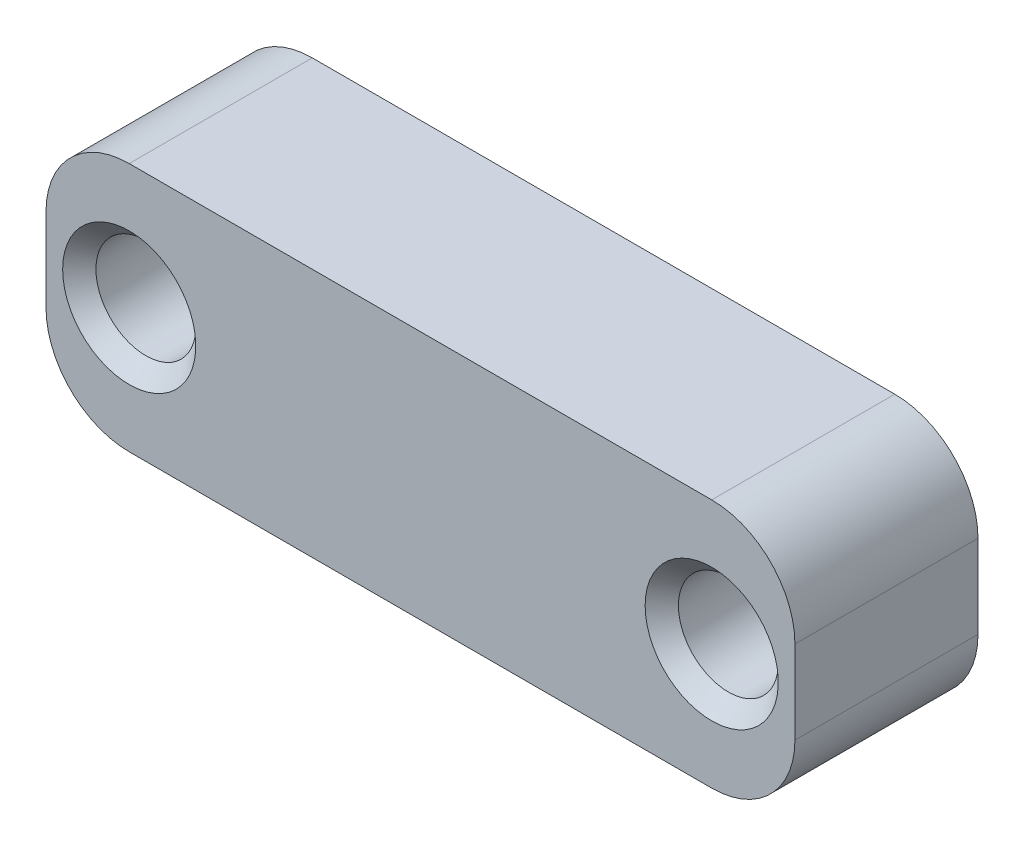
ISO-10303-21;
HEADER;
FILE_DESCRIPTION(('STEP AP214'),'2;1');
FILE_NAME('part.step','',(''),(''),'','','');
FILE_SCHEMA(('AUTOMOTIVE_DESIGN { 1 0 10303 214 1 1 1 1 }'));
ENDSEC;
DATA;
#1=APPLICATION_CONTEXT('core data for automotive mechanical design processes');
#2=APPLICATION_PROTOCOL_DEFINITION('international standard','automotive_design',2000,#1);
#3=PRODUCT_CONTEXT('',#1,'mechanical');
#4=PRODUCT('Part','Part','',(#3));
#5=PRODUCT_RELATED_PRODUCT_CATEGORY('part','',(#4));
#6=PRODUCT_DEFINITION_FORMATION('','',#4);
#7=PRODUCT_DEFINITION_CONTEXT('part definition',#1,'design');
#8=PRODUCT_DEFINITION('design','',#6,#7);
#9=PRODUCT_DEFINITION_SHAPE('','',#8);
#10=(LENGTH_UNIT() NAMED_UNIT(*) SI_UNIT(.MILLI.,.METRE.));
#11=(NAMED_UNIT(*) PLANE_ANGLE_UNIT() SI_UNIT($,.RADIAN.));
#12=(NAMED_UNIT(*) SI_UNIT($,.STERADIAN.) SOLID_ANGLE_UNIT());
#13=UNCERTAINTY_MEASURE_WITH_UNIT(LENGTH_MEASURE(1.E-05),#10,'distance_accuracy_value','');
#14=(GEOMETRIC_REPRESENTATION_CONTEXT(3) GLOBAL_UNCERTAINTY_ASSIGNED_CONTEXT((#13)) GLOBAL_UNIT_ASSIGNED_CONTEXT((#10,
#11,#12)) REPRESENTATION_CONTEXT('',''));
#15=CARTESIAN_POINT('',(0.,0.,0.));
#16=DIRECTION('',(0.,0.,1.));
#17=DIRECTION('',(1.,0.,0.));
#18=AXIS2_PLACEMENT_3D('',#15,#16,#17);
#19=CARTESIAN_POINT('',(0.,0.,11.));
#20=DIRECTION('',(0.,0.,-1.));
#21=DIRECTION('',(-1.,0.,0.));
#22=AXIS2_PLACEMENT_3D('',#19,#20,#21);
#23=PLANE('',#22);
#24=CARTESIAN_POINT('',(40.,7.5,11.));
#25=DIRECTION('',(0.,0.,-1.));
#26=DIRECTION('',(-1.,0.,0.));
#27=AXIS2_PLACEMENT_3D('',#24,#25,#26);
#28=CIRCLE('',#27,4.00000000000001);
#29=CARTESIAN_POINT('',(36.,7.5,11.));
#30=VERTEX_POINT('',#29);
#31=EDGE_CURVE('E41',#30,#30,#28,.T.);
#32=ORIENTED_EDGE('',*,*,#31,.T.);
#33=EDGE_LOOP('',(#32));
#34=FACE_BOUND('',#33,.T.);
#35=CARTESIAN_POINT('',(5.,7.5,11.));
#36=DIRECTION('',(0.,0.,-1.));
#37=DIRECTION('',(-1.,0.,0.));
#38=AXIS2_PLACEMENT_3D('',#35,#36,#37);
#39=CIRCLE('',#38,4.);
#40=CARTESIAN_POINT('',(1.,7.5,11.));
#41=VERTEX_POINT('',#40);
#42=EDGE_CURVE('E170',#41,#41,#39,.T.);
#43=ORIENTED_EDGE('',*,*,#42,.T.);
#44=EDGE_LOOP('',(#43));
#45=FACE_BOUND('',#44,.T.);
#46=DIRECTION('',(0.,-1.,0.));
#47=VECTOR('',#46,1.);
#48=CARTESIAN_POINT('',(0.,0.,11.));
#49=LINE('',#48,#47);
#50=CARTESIAN_POINT('',(0.,10.,11.));
#51=VERTEX_POINT('',#50);
#52=CARTESIAN_POINT('',(0.,5.,11.));
#53=VERTEX_POINT('',#52);
#54=EDGE_CURVE('E137',#51,#53,#49,.T.);
#55=ORIENTED_EDGE('',*,*,#54,.T.);
#56=CARTESIAN_POINT('',(5.,5.,11.));
#57=DIRECTION('',(0.,0.,-1.));
#58=DIRECTION('',(-1.,0.,0.));
#59=AXIS2_PLACEMENT_3D('',#56,#57,#58);
#60=CIRCLE('',#59,5.);
#61=CARTESIAN_POINT('',(5.00000000000001,0.,11.));
#62=VERTEX_POINT('',#61);
#63=EDGE_CURVE('E156',#53,#62,#60,.F.);
#64=ORIENTED_EDGE('',*,*,#63,.T.);
#65=DIRECTION('',(1.,0.,0.));
#66=VECTOR('',#65,1.);
#67=CARTESIAN_POINT('',(45.,0.,11.));
#68=LINE('',#67,#66);
#69=CARTESIAN_POINT('',(40.,0.,11.));
#70=VERTEX_POINT('',#69);
#71=EDGE_CURVE('E120',#62,#70,#68,.T.);
#72=ORIENTED_EDGE('',*,*,#71,.T.);
#73=CARTESIAN_POINT('',(40.,5.,11.));
#74=DIRECTION('',(0.,0.,-1.));
#75=DIRECTION('',(-1.,0.,0.));
#76=AXIS2_PLACEMENT_3D('',#73,#74,#75);
#77=CIRCLE('',#76,5.);
#78=CARTESIAN_POINT('',(45.,5.,11.));
#79=VERTEX_POINT('',#78);
#80=EDGE_CURVE('E154',#70,#79,#77,.F.);
#81=ORIENTED_EDGE('',*,*,#80,.T.);
#82=DIRECTION('',(0.,1.,0.));
#83=VECTOR('',#82,1.);
#84=CARTESIAN_POINT('',(45.,15.,11.));
#85=LINE('',#84,#83);
#86=CARTESIAN_POINT('',(45.,10.,11.));
#87=VERTEX_POINT('',#86);
#88=EDGE_CURVE('E193',#79,#87,#85,.T.);
#89=ORIENTED_EDGE('',*,*,#88,.T.);
#90=CARTESIAN_POINT('',(40.,10.,11.));
#91=DIRECTION('',(0.,0.,-1.));
#92=DIRECTION('',(-1.,0.,0.));
#93=AXIS2_PLACEMENT_3D('',#90,#91,#92);
#94=CIRCLE('',#93,5.);
#95=CARTESIAN_POINT('',(40.,15.,11.));
#96=VERTEX_POINT('',#95);
#97=EDGE_CURVE('E55',#87,#96,#94,.F.);
#98=ORIENTED_EDGE('',*,*,#97,.T.);
#99=DIRECTION('',(-1.,0.,0.));
#100=VECTOR('',#99,1.);
#101=CARTESIAN_POINT('',(0.,15.,11.));
#102=LINE('',#101,#100);
#103=CARTESIAN_POINT('',(5.,15.,11.));
#104=VERTEX_POINT('',#103);
#105=EDGE_CURVE('E194',#96,#104,#102,.T.);
#106=ORIENTED_EDGE('',*,*,#105,.T.);
#107=CARTESIAN_POINT('',(5.,10.,11.));
#108=DIRECTION('',(0.,0.,-1.));
#109=DIRECTION('',(-1.,0.,0.));
#110=AXIS2_PLACEMENT_3D('',#107,#108,#109);
#111=CIRCLE('',#110,5.);
#112=EDGE_CURVE('E151',#104,#51,#111,.F.);
#113=ORIENTED_EDGE('',*,*,#112,.T.);
#114=EDGE_LOOP('',(#55,#64,#72,#81,#89,#98,#106,#113));
#115=FACE_BOUND('',#114,.T.);
#116=ADVANCED_FACE('F33',(#34,#45,#115),#23,.F.);
#117=CARTESIAN_POINT('',(0.,0.,0.));
#118=DIRECTION('',(0.,0.,-1.));
#119=DIRECTION('',(-1.,0.,0.));
#120=AXIS2_PLACEMENT_3D('',#117,#118,#119);
#121=PLANE('',#120);
#122=CARTESIAN_POINT('',(5.,7.5,0.));
#123=DIRECTION('',(0.,0.,1.));
#124=DIRECTION('',(1.,0.,0.));
#125=AXIS2_PLACEMENT_3D('',#122,#123,#124);
#126=CIRCLE('',#125,3.);
#127=CARTESIAN_POINT('',(8.,7.5,0.));
#128=VERTEX_POINT('',#127);
#129=EDGE_CURVE('E128',#128,#128,#126,.T.);
#130=ORIENTED_EDGE('',*,*,#129,.T.);
#131=EDGE_LOOP('',(#130));
#132=FACE_BOUND('',#131,.T.);
#133=DIRECTION('',(1.,0.,0.));
#134=VECTOR('',#133,1.);
#135=CARTESIAN_POINT('',(45.,0.,0.));
#136=LINE('',#135,#134);
#137=CARTESIAN_POINT('',(5.00000000000001,0.,0.));
#138=VERTEX_POINT('',#137);
#139=CARTESIAN_POINT('',(40.,0.,0.));
#140=VERTEX_POINT('',#139);
#141=EDGE_CURVE('E117',#138,#140,#136,.T.);
#142=ORIENTED_EDGE('',*,*,#141,.F.);
#143=CARTESIAN_POINT('',(5.,5.,0.));
#144=DIRECTION('',(0.,0.,-1.));
#145=DIRECTION('',(-1.,0.,0.));
#146=AXIS2_PLACEMENT_3D('',#143,#144,#145);
#147=CIRCLE('',#146,5.);
#148=CARTESIAN_POINT('',(0.,5.,0.));
#149=VERTEX_POINT('',#148);
#150=EDGE_CURVE('E100',#138,#149,#147,.T.);
#151=ORIENTED_EDGE('',*,*,#150,.T.);
#152=DIRECTION('',(0.,-1.,0.));
#153=VECTOR('',#152,1.);
#154=CARTESIAN_POINT('',(0.,0.,0.));
#155=LINE('',#154,#153);
#156=CARTESIAN_POINT('',(0.,10.,0.));
#157=VERTEX_POINT('',#156);
#158=EDGE_CURVE('E141',#157,#149,#155,.T.);
#159=ORIENTED_EDGE('',*,*,#158,.F.);
#160=CARTESIAN_POINT('',(5.,10.,0.));
#161=DIRECTION('',(0.,0.,-1.));
#162=DIRECTION('',(-1.,0.,0.));
#163=AXIS2_PLACEMENT_3D('',#160,#161,#162);
#164=CIRCLE('',#163,5.);
#165=CARTESIAN_POINT('',(5.,15.,0.));
#166=VERTEX_POINT('',#165);
#167=EDGE_CURVE('E121',#157,#166,#164,.T.);
#168=ORIENTED_EDGE('',*,*,#167,.T.);
#169=DIRECTION('',(-1.,0.,0.));
#170=VECTOR('',#169,1.);
#171=CARTESIAN_POINT('',(0.,15.,0.));
#172=LINE('',#171,#170);
#173=CARTESIAN_POINT('',(40.,15.,0.));
#174=VERTEX_POINT('',#173);
#175=EDGE_CURVE('E131',#174,#166,#172,.T.);
#176=ORIENTED_EDGE('',*,*,#175,.F.);
#177=CARTESIAN_POINT('',(40.,10.,0.));
#178=DIRECTION('',(0.,0.,-1.));
#179=DIRECTION('',(-1.,0.,0.));
#180=AXIS2_PLACEMENT_3D('',#177,#178,#179);
#181=CIRCLE('',#180,5.);
#182=CARTESIAN_POINT('',(45.,10.,0.));
#183=VERTEX_POINT('',#182);
#184=EDGE_CURVE('E145',#174,#183,#181,.T.);
#185=ORIENTED_EDGE('',*,*,#184,.T.);
#186=DIRECTION('',(0.,1.,0.));
#187=VECTOR('',#186,1.);
#188=CARTESIAN_POINT('',(45.,15.,0.));
#189=LINE('',#188,#187);
#190=CARTESIAN_POINT('',(45.,5.,0.));
#191=VERTEX_POINT('',#190);
#192=EDGE_CURVE('E127',#191,#183,#189,.T.);
#193=ORIENTED_EDGE('',*,*,#192,.F.);
#194=CARTESIAN_POINT('',(40.,5.,0.));
#195=DIRECTION('',(0.,0.,-1.));
#196=DIRECTION('',(-1.,0.,0.));
#197=AXIS2_PLACEMENT_3D('',#194,#195,#196);
#198=CIRCLE('',#197,5.);
#199=EDGE_CURVE('E111',#191,#140,#198,.T.);
#200=ORIENTED_EDGE('',*,*,#199,.T.);
#201=EDGE_LOOP('',(#142,#151,#159,#168,#176,#185,#193,#200));
#202=FACE_BOUND('',#201,.T.);
#203=CARTESIAN_POINT('',(40.,7.5,0.));
#204=DIRECTION('',(0.,0.,1.));
#205=DIRECTION('',(1.,0.,0.));
#206=AXIS2_PLACEMENT_3D('',#203,#204,#205);
#207=CIRCLE('',#206,2.99999999999999);
#208=CARTESIAN_POINT('',(43.,7.5,0.));
#209=VERTEX_POINT('',#208);
#210=EDGE_CURVE('E134',#209,#209,#207,.T.);
#211=ORIENTED_EDGE('',*,*,#210,.T.);
#212=EDGE_LOOP('',(#211));
#213=FACE_BOUND('',#212,.T.);
#214=ADVANCED_FACE('F124',(#132,#202,#213),#121,.T.);
#215=CARTESIAN_POINT('',(45.,0.,11.));
#216=DIRECTION('',(0.,1.,0.));
#217=DIRECTION('',(-1.,0.,0.));
#218=AXIS2_PLACEMENT_3D('',#215,#216,#217);
#219=PLANE('',#218);
#220=ORIENTED_EDGE('',*,*,#71,.F.);
#221=DIRECTION('',(0.,0.,-1.));
#222=VECTOR('',#221,1.);
#223=CARTESIAN_POINT('',(5.,0.,11.));
#224=LINE('',#223,#222);
#225=EDGE_CURVE('E104',#62,#138,#224,.T.);
#226=ORIENTED_EDGE('',*,*,#225,.T.);
#227=ORIENTED_EDGE('',*,*,#141,.T.);
#228=DIRECTION('',(0.,0.,-1.));
#229=VECTOR('',#228,1.);
#230=CARTESIAN_POINT('',(40.,0.,11.));
#231=LINE('',#230,#229);
#232=EDGE_CURVE('E122',#140,#70,#231,.F.);
#233=ORIENTED_EDGE('',*,*,#232,.T.);
#234=EDGE_LOOP('',(#220,#226,#227,#233));
#235=FACE_BOUND('',#234,.T.);
#236=ADVANCED_FACE('F116',(#235),#219,.F.);
#237=CARTESIAN_POINT('',(45.,15.,11.));
#238=DIRECTION('',(-1.,0.,0.));
#239=DIRECTION('',(0.,0.,1.));
#240=AXIS2_PLACEMENT_3D('',#237,#238,#239);
#241=PLANE('',#240);
#242=ORIENTED_EDGE('',*,*,#88,.F.);
#243=DIRECTION('',(0.,0.,-1.));
#244=VECTOR('',#243,1.);
#245=CARTESIAN_POINT('',(45.,5.,11.));
#246=LINE('',#245,#244);
#247=EDGE_CURVE('E160',#79,#191,#246,.T.);
#248=ORIENTED_EDGE('',*,*,#247,.T.);
#249=ORIENTED_EDGE('',*,*,#192,.T.);
#250=DIRECTION('',(0.,0.,-1.));
#251=VECTOR('',#250,1.);
#252=CARTESIAN_POINT('',(45.,10.,11.));
#253=LINE('',#252,#251);
#254=EDGE_CURVE('E158',#183,#87,#253,.F.);
#255=ORIENTED_EDGE('',*,*,#254,.T.);
#256=EDGE_LOOP('',(#242,#248,#249,#255));
#257=FACE_BOUND('',#256,.T.);
#258=ADVANCED_FACE('F210',(#257),#241,.F.);
#259=CARTESIAN_POINT('',(0.,15.,11.));
#260=DIRECTION('',(0.,-1.,0.));
#261=DIRECTION('',(0.,0.,-1.));
#262=AXIS2_PLACEMENT_3D('',#259,#260,#261);
#263=PLANE('',#262);
#264=ORIENTED_EDGE('',*,*,#105,.F.);
#265=DIRECTION('',(0.,0.,-1.));
#266=VECTOR('',#265,1.);
#267=CARTESIAN_POINT('',(40.,15.,11.));
#268=LINE('',#267,#266);
#269=EDGE_CURVE('E164',#96,#174,#268,.T.);
#270=ORIENTED_EDGE('',*,*,#269,.T.);
#271=ORIENTED_EDGE('',*,*,#175,.T.);
#272=DIRECTION('',(0.,0.,-1.));
#273=VECTOR('',#272,1.);
#274=CARTESIAN_POINT('',(5.,15.,11.));
#275=LINE('',#274,#273);
#276=EDGE_CURVE('E48',#166,#104,#275,.F.);
#277=ORIENTED_EDGE('',*,*,#276,.T.);
#278=EDGE_LOOP('',(#264,#270,#271,#277));
#279=FACE_BOUND('',#278,.T.);
#280=ADVANCED_FACE('F203',(#279),#263,.F.);
#281=CARTESIAN_POINT('',(0.,0.,11.));
#282=DIRECTION('',(1.,0.,0.));
#283=DIRECTION('',(0.,0.,-1.));
#284=AXIS2_PLACEMENT_3D('',#281,#282,#283);
#285=PLANE('',#284);
#286=ORIENTED_EDGE('',*,*,#158,.T.);
#287=DIRECTION('',(0.,0.,-1.));
#288=VECTOR('',#287,1.);
#289=CARTESIAN_POINT('',(0.,5.,11.));
#290=LINE('',#289,#288);
#291=EDGE_CURVE('E105',#149,#53,#290,.F.);
#292=ORIENTED_EDGE('',*,*,#291,.T.);
#293=ORIENTED_EDGE('',*,*,#54,.F.);
#294=DIRECTION('',(0.,0.,-1.));
#295=VECTOR('',#294,1.);
#296=CARTESIAN_POINT('',(0.,10.,11.));
#297=LINE('',#296,#295);
#298=EDGE_CURVE('E110',#51,#157,#297,.T.);
#299=ORIENTED_EDGE('',*,*,#298,.T.);
#300=EDGE_LOOP('',(#286,#292,#293,#299));
#301=FACE_BOUND('',#300,.T.);
#302=ADVANCED_FACE('F200',(#301),#285,.F.);
#303=CARTESIAN_POINT('',(5.,7.5,11.));
#304=DIRECTION('',(0.,0.,-1.));
#305=DIRECTION('',(-1.,0.,0.));
#306=AXIS2_PLACEMENT_3D('',#303,#304,#305);
#307=CYLINDRICAL_SURFACE('',#306,3.);
#308=CARTESIAN_POINT('',(5.,7.5,10.));
#309=DIRECTION('',(0.,0.,-1.));
#310=DIRECTION('',(-1.,0.,0.));
#311=AXIS2_PLACEMENT_3D('',#308,#309,#310);
#312=CIRCLE('',#311,3.);
#313=CARTESIAN_POINT('',(2.,7.5,10.));
#314=VERTEX_POINT('',#313);
#315=EDGE_CURVE('E11',#314,#314,#312,.F.);
#316=ORIENTED_EDGE('',*,*,#315,.T.);
#317=EDGE_LOOP('',(#316));
#318=FACE_BOUND('',#317,.T.);
#319=ORIENTED_EDGE('',*,*,#129,.F.);
#320=EDGE_LOOP('',(#319));
#321=FACE_BOUND('',#320,.T.);
#322=ADVANCED_FACE('F186',(#318,#321),#307,.F.);
#323=CARTESIAN_POINT('',(40.,7.5,11.));
#324=DIRECTION('',(0.,0.,-1.));
#325=DIRECTION('',(-1.,0.,0.));
#326=AXIS2_PLACEMENT_3D('',#323,#324,#325);
#327=CYLINDRICAL_SURFACE('',#326,2.99999999999999);
#328=CARTESIAN_POINT('',(40.,7.5,9.99999999999999));
#329=DIRECTION('',(0.,0.,-1.));
#330=DIRECTION('',(-1.,0.,0.));
#331=AXIS2_PLACEMENT_3D('',#328,#329,#330);
#332=CIRCLE('',#331,2.99999999999999);
#333=CARTESIAN_POINT('',(37.,7.5,9.99999999999999));
#334=VERTEX_POINT('',#333);
#335=EDGE_CURVE('E167',#334,#334,#332,.F.);
#336=ORIENTED_EDGE('',*,*,#335,.T.);
#337=EDGE_LOOP('',(#336));
#338=FACE_BOUND('',#337,.T.);
#339=ORIENTED_EDGE('',*,*,#210,.F.);
#340=EDGE_LOOP('',(#339));
#341=FACE_BOUND('',#340,.T.);
#342=ADVANCED_FACE('F183',(#338,#341),#327,.F.);
#343=CARTESIAN_POINT('',(5.,5.,11.));
#344=DIRECTION('',(0.,0.,-1.));
#345=DIRECTION('',(-1.,0.,0.));
#346=AXIS2_PLACEMENT_3D('',#343,#344,#345);
#347=CYLINDRICAL_SURFACE('',#346,5.);
#348=ORIENTED_EDGE('',*,*,#63,.F.);
#349=ORIENTED_EDGE('',*,*,#291,.F.);
#350=ORIENTED_EDGE('',*,*,#150,.F.);
#351=ORIENTED_EDGE('',*,*,#225,.F.);
#352=EDGE_LOOP('',(#348,#349,#350,#351));
#353=FACE_BOUND('',#352,.T.);
#354=ADVANCED_FACE('F103',(#353),#347,.T.);
#355=CARTESIAN_POINT('',(40.,5.,11.));
#356=DIRECTION('',(0.,0.,-1.));
#357=DIRECTION('',(-1.,0.,0.));
#358=AXIS2_PLACEMENT_3D('',#355,#356,#357);
#359=CYLINDRICAL_SURFACE('',#358,5.);
#360=ORIENTED_EDGE('',*,*,#80,.F.);
#361=ORIENTED_EDGE('',*,*,#232,.F.);
#362=ORIENTED_EDGE('',*,*,#199,.F.);
#363=ORIENTED_EDGE('',*,*,#247,.F.);
#364=EDGE_LOOP('',(#360,#361,#362,#363));
#365=FACE_BOUND('',#364,.T.);
#366=ADVANCED_FACE('F214',(#365),#359,.T.);
#367=CARTESIAN_POINT('',(40.,10.,11.));
#368=DIRECTION('',(0.,0.,-1.));
#369=DIRECTION('',(-1.,0.,0.));
#370=AXIS2_PLACEMENT_3D('',#367,#368,#369);
#371=CYLINDRICAL_SURFACE('',#370,5.);
#372=ORIENTED_EDGE('',*,*,#97,.F.);
#373=ORIENTED_EDGE('',*,*,#254,.F.);
#374=ORIENTED_EDGE('',*,*,#184,.F.);
#375=ORIENTED_EDGE('',*,*,#269,.F.);
#376=EDGE_LOOP('',(#372,#373,#374,#375));
#377=FACE_BOUND('',#376,.T.);
#378=ADVANCED_FACE('F206',(#377),#371,.T.);
#379=CARTESIAN_POINT('',(5.,10.,11.));
#380=DIRECTION('',(0.,0.,-1.));
#381=DIRECTION('',(-1.,0.,0.));
#382=AXIS2_PLACEMENT_3D('',#379,#380,#381);
#383=CYLINDRICAL_SURFACE('',#382,5.);
#384=ORIENTED_EDGE('',*,*,#112,.F.);
#385=ORIENTED_EDGE('',*,*,#276,.F.);
#386=ORIENTED_EDGE('',*,*,#167,.F.);
#387=ORIENTED_EDGE('',*,*,#298,.F.);
#388=EDGE_LOOP('',(#384,#385,#386,#387));
#389=FACE_BOUND('',#388,.T.);
#390=ADVANCED_FACE('F180',(#389),#383,.T.);
#391=CARTESIAN_POINT('',(40.,7.5,9.99999999999999));
#392=DIRECTION('',(0.,0.,1.));
#393=DIRECTION('',(1.,0.,0.));
#394=AXIS2_PLACEMENT_3D('',#391,#392,#393);
#395=CONICAL_SURFACE('',#394,2.99999999999999,0.785398163397453);
#396=ORIENTED_EDGE('',*,*,#31,.F.);
#397=EDGE_LOOP('',(#396));
#398=FACE_BOUND('',#397,.T.);
#399=ORIENTED_EDGE('',*,*,#335,.F.);
#400=EDGE_LOOP('',(#399));
#401=FACE_BOUND('',#400,.T.);
#402=ADVANCED_FACE('F177',(#398,#401),#395,.F.);
#403=CARTESIAN_POINT('',(5.,7.5,10.));
#404=DIRECTION('',(0.,0.,1.));
#405=DIRECTION('',(1.,0.,0.));
#406=AXIS2_PLACEMENT_3D('',#403,#404,#405);
#407=CONICAL_SURFACE('',#406,3.,0.785398163397449);
#408=ORIENTED_EDGE('',*,*,#42,.F.);
#409=EDGE_LOOP('',(#408));
#410=FACE_BOUND('',#409,.T.);
#411=ORIENTED_EDGE('',*,*,#315,.F.);
#412=EDGE_LOOP('',(#411));
#413=FACE_BOUND('',#412,.T.);
#414=ADVANCED_FACE('F35',(#410,#413),#407,.F.);
#415=CLOSED_SHELL('',(#116,#214,#236,#258,#280,#302,#322,#342,#354,#366,#378,#390,#402,#414));
#416=MANIFOLD_SOLID_BREP('B2',#415);
#417=ADVANCED_BREP_SHAPE_REPRESENTATION('',(#18,#416),#14);
#418=SHAPE_DEFINITION_REPRESENTATION(#9,#417);
ENDSEC;
END-ISO-10303-21;
